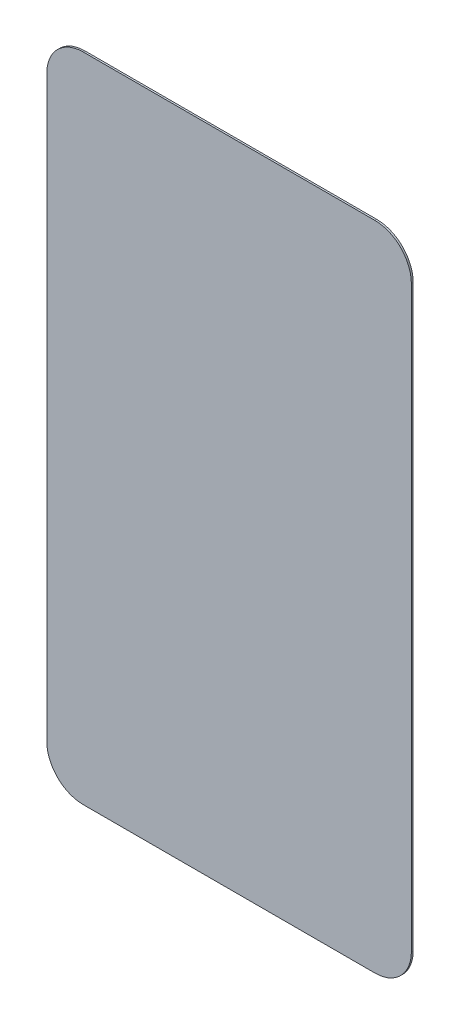
ISO-10303-21;
HEADER;
FILE_DESCRIPTION(('STEP AP214'),'2;1');
FILE_NAME('part.step','',(''),(''),'','','');
FILE_SCHEMA(('AUTOMOTIVE_DESIGN { 1 0 10303 214 1 1 1 1 }'));
ENDSEC;
DATA;
#1=APPLICATION_CONTEXT('core data for automotive mechanical design processes');
#2=APPLICATION_PROTOCOL_DEFINITION('international standard','automotive_design',2000,#1);
#3=PRODUCT_CONTEXT('',#1,'mechanical');
#4=PRODUCT('Part','Part','',(#3));
#5=PRODUCT_RELATED_PRODUCT_CATEGORY('part','',(#4));
#6=PRODUCT_DEFINITION_FORMATION('','',#4);
#7=PRODUCT_DEFINITION_CONTEXT('part definition',#1,'design');
#8=PRODUCT_DEFINITION('design','',#6,#7);
#9=PRODUCT_DEFINITION_SHAPE('','',#8);
#10=(LENGTH_UNIT() NAMED_UNIT(*) SI_UNIT(.MILLI.,.METRE.));
#11=(NAMED_UNIT(*) PLANE_ANGLE_UNIT() SI_UNIT($,.RADIAN.));
#12=(NAMED_UNIT(*) SI_UNIT($,.STERADIAN.) SOLID_ANGLE_UNIT());
#13=UNCERTAINTY_MEASURE_WITH_UNIT(LENGTH_MEASURE(1.E-05),#10,'distance_accuracy_value','');
#14=(GEOMETRIC_REPRESENTATION_CONTEXT(3) GLOBAL_UNCERTAINTY_ASSIGNED_CONTEXT((#13)) GLOBAL_UNIT_ASSIGNED_CONTEXT((#10,
#11,#12)) REPRESENTATION_CONTEXT('',''));
#15=CARTESIAN_POINT('',(0.,0.,0.));
#16=DIRECTION('',(0.,0.,1.));
#17=DIRECTION('',(1.,0.,0.));
#18=AXIS2_PLACEMENT_3D('',#15,#16,#17);
#19=CARTESIAN_POINT('',(-32.4685295093058,81.3436245572609,0.5));
#20=DIRECTION('',(0.,0.,-1.));
#21=DIRECTION('',(-1.,0.,0.));
#22=AXIS2_PLACEMENT_3D('',#19,#20,#21);
#23=CYLINDRICAL_SURFACE('',#22,9.99999999999999);
#24=CARTESIAN_POINT('',(-32.4685295093058,81.3436245572609,0.));
#25=DIRECTION('',(0.,0.,1.));
#26=DIRECTION('',(1.,0.,0.));
#27=AXIS2_PLACEMENT_3D('',#24,#25,#26);
#28=CIRCLE('',#27,9.99999999999999);
#29=CARTESIAN_POINT('',(-32.4685295093058,91.3436245572609,0.));
#30=VERTEX_POINT('',#29);
#31=CARTESIAN_POINT('',(-42.4685295093058,81.3436245572609,0.));
#32=VERTEX_POINT('',#31);
#33=EDGE_CURVE('E127',#30,#32,#28,.T.);
#34=ORIENTED_EDGE('',*,*,#33,.T.);
#35=DIRECTION('',(0.,0.,-1.));
#36=VECTOR('',#35,1.);
#37=CARTESIAN_POINT('',(-42.4685295093058,81.3436245572609,0.5));
#38=LINE('',#37,#36);
#39=CARTESIAN_POINT('',(-42.4685295093058,81.3436245572609,0.5));
#40=VERTEX_POINT('',#39);
#41=EDGE_CURVE('E11',#40,#32,#38,.T.);
#42=ORIENTED_EDGE('',*,*,#41,.F.);
#43=CARTESIAN_POINT('',(-32.4685295093058,81.3436245572609,0.5));
#44=DIRECTION('',(0.,0.,1.));
#45=DIRECTION('',(1.,0.,0.));
#46=AXIS2_PLACEMENT_3D('',#43,#44,#45);
#47=CIRCLE('',#46,9.99999999999999);
#48=CARTESIAN_POINT('',(-32.4685295093058,91.3436245572609,0.5));
#49=VERTEX_POINT('',#48);
#50=EDGE_CURVE('E141',#49,#40,#47,.T.);
#51=ORIENTED_EDGE('',*,*,#50,.F.);
#52=DIRECTION('',(0.,0.,-1.));
#53=VECTOR('',#52,1.);
#54=CARTESIAN_POINT('',(-32.4685295093058,91.3436245572609,0.5));
#55=LINE('',#54,#53);
#56=EDGE_CURVE('E123',#49,#30,#55,.T.);
#57=ORIENTED_EDGE('',*,*,#56,.T.);
#58=EDGE_LOOP('',(#34,#42,#51,#57));
#59=FACE_BOUND('',#58,.T.);
#60=ADVANCED_FACE('F31',(#59),#23,.T.);
#61=CARTESIAN_POINT('',(-42.4685295093058,81.3436245572609,0.5));
#62=DIRECTION('',(1.,0.,0.));
#63=DIRECTION('',(0.,1.,0.));
#64=AXIS2_PLACEMENT_3D('',#61,#62,#63);
#65=PLANE('',#64);
#66=DIRECTION('',(0.,-1.,0.));
#67=VECTOR('',#66,1.);
#68=CARTESIAN_POINT('',(-42.4685295093058,81.3436245572609,0.));
#69=LINE('',#68,#67);
#70=CARTESIAN_POINT('',(-42.4685295093058,-77.4713540090674,0.));
#71=VERTEX_POINT('',#70);
#72=EDGE_CURVE('E130',#32,#71,#69,.T.);
#73=ORIENTED_EDGE('',*,*,#72,.T.);
#74=DIRECTION('',(0.,0.,-1.));
#75=VECTOR('',#74,1.);
#76=CARTESIAN_POINT('',(-42.4685295093058,-77.4713540090674,0.5));
#77=LINE('',#76,#75);
#78=CARTESIAN_POINT('',(-42.4685295093058,-77.4713540090674,0.5));
#79=VERTEX_POINT('',#78);
#80=EDGE_CURVE('E39',#79,#71,#77,.T.);
#81=ORIENTED_EDGE('',*,*,#80,.F.);
#82=DIRECTION('',(0.,-1.,0.));
#83=VECTOR('',#82,1.);
#84=CARTESIAN_POINT('',(-42.4685295093058,81.3436245572609,0.5));
#85=LINE('',#84,#83);
#86=EDGE_CURVE('E90',#40,#79,#85,.T.);
#87=ORIENTED_EDGE('',*,*,#86,.F.);
#88=ORIENTED_EDGE('',*,*,#41,.T.);
#89=EDGE_LOOP('',(#73,#81,#87,#88));
#90=FACE_BOUND('',#89,.T.);
#91=ADVANCED_FACE('F176',(#90),#65,.F.);
#92=CARTESIAN_POINT('',(-32.4685295093058,-77.4713540090674,0.5));
#93=DIRECTION('',(0.,0.,-1.));
#94=DIRECTION('',(-1.,0.,0.));
#95=AXIS2_PLACEMENT_3D('',#92,#93,#94);
#96=CYLINDRICAL_SURFACE('',#95,10.);
#97=CARTESIAN_POINT('',(-32.4685295093058,-77.4713540090674,0.));
#98=DIRECTION('',(0.,0.,1.));
#99=DIRECTION('',(1.,0.,0.));
#100=AXIS2_PLACEMENT_3D('',#97,#98,#99);
#101=CIRCLE('',#100,10.);
#102=CARTESIAN_POINT('',(-32.4685295093058,-87.4713540090674,0.));
#103=VERTEX_POINT('',#102);
#104=EDGE_CURVE('E132',#71,#103,#101,.T.);
#105=ORIENTED_EDGE('',*,*,#104,.T.);
#106=DIRECTION('',(0.,0.,-1.));
#107=VECTOR('',#106,1.);
#108=CARTESIAN_POINT('',(-32.4685295093058,-87.4713540090674,0.5));
#109=LINE('',#108,#107);
#110=CARTESIAN_POINT('',(-32.4685295093058,-87.4713540090674,0.5));
#111=VERTEX_POINT('',#110);
#112=EDGE_CURVE('E148',#111,#103,#109,.T.);
#113=ORIENTED_EDGE('',*,*,#112,.F.);
#114=CARTESIAN_POINT('',(-32.4685295093058,-77.4713540090674,0.5));
#115=DIRECTION('',(0.,0.,1.));
#116=DIRECTION('',(1.,0.,0.));
#117=AXIS2_PLACEMENT_3D('',#114,#115,#116);
#118=CIRCLE('',#117,10.);
#119=EDGE_CURVE('E156',#79,#111,#118,.T.);
#120=ORIENTED_EDGE('',*,*,#119,.F.);
#121=ORIENTED_EDGE('',*,*,#80,.T.);
#122=EDGE_LOOP('',(#105,#113,#120,#121));
#123=FACE_BOUND('',#122,.T.);
#124=ADVANCED_FACE('F154',(#123),#96,.T.);
#125=CARTESIAN_POINT('',(-32.4685295093058,-87.4713540090674,0.5));
#126=DIRECTION('',(0.,1.,0.));
#127=DIRECTION('',(0.,0.,1.));
#128=AXIS2_PLACEMENT_3D('',#125,#126,#127);
#129=PLANE('',#128);
#130=DIRECTION('',(1.,0.,0.));
#131=VECTOR('',#130,1.);
#132=CARTESIAN_POINT('',(-32.4685295093058,-87.4713540090674,0.));
#133=LINE('',#132,#131);
#134=CARTESIAN_POINT('',(47.5314704906942,-87.4713540090674,0.));
#135=VERTEX_POINT('',#134);
#136=EDGE_CURVE('E134',#103,#135,#133,.T.);
#137=ORIENTED_EDGE('',*,*,#136,.T.);
#138=DIRECTION('',(0.,0.,-1.));
#139=VECTOR('',#138,1.);
#140=CARTESIAN_POINT('',(47.5314704906942,-87.4713540090674,0.5));
#141=LINE('',#140,#139);
#142=CARTESIAN_POINT('',(47.5314704906942,-87.4713540090674,0.5));
#143=VERTEX_POINT('',#142);
#144=EDGE_CURVE('E145',#143,#135,#141,.T.);
#145=ORIENTED_EDGE('',*,*,#144,.F.);
#146=DIRECTION('',(1.,0.,0.));
#147=VECTOR('',#146,1.);
#148=CARTESIAN_POINT('',(-32.4685295093058,-87.4713540090674,0.5));
#149=LINE('',#148,#147);
#150=EDGE_CURVE('E168',#111,#143,#149,.T.);
#151=ORIENTED_EDGE('',*,*,#150,.F.);
#152=ORIENTED_EDGE('',*,*,#112,.T.);
#153=EDGE_LOOP('',(#137,#145,#151,#152));
#154=FACE_BOUND('',#153,.T.);
#155=ADVANCED_FACE('F164',(#154),#129,.F.);
#156=CARTESIAN_POINT('',(47.5314704906942,-77.4713540090674,0.5));
#157=DIRECTION('',(0.,0.,-1.));
#158=DIRECTION('',(-1.,0.,0.));
#159=AXIS2_PLACEMENT_3D('',#156,#157,#158);
#160=CYLINDRICAL_SURFACE('',#159,10.);
#161=CARTESIAN_POINT('',(47.5314704906942,-77.4713540090674,0.));
#162=DIRECTION('',(0.,0.,1.));
#163=DIRECTION('',(1.,0.,0.));
#164=AXIS2_PLACEMENT_3D('',#161,#162,#163);
#165=CIRCLE('',#164,10.);
#166=CARTESIAN_POINT('',(57.5314704906942,-77.4713540090674,0.));
#167=VERTEX_POINT('',#166);
#168=EDGE_CURVE('E136',#135,#167,#165,.T.);
#169=ORIENTED_EDGE('',*,*,#168,.T.);
#170=DIRECTION('',(0.,0.,-1.));
#171=VECTOR('',#170,1.);
#172=CARTESIAN_POINT('',(57.5314704906942,-77.4713540090674,0.5));
#173=LINE('',#172,#171);
#174=CARTESIAN_POINT('',(57.5314704906942,-77.4713540090674,0.5));
#175=VERTEX_POINT('',#174);
#176=EDGE_CURVE('E118',#175,#167,#173,.T.);
#177=ORIENTED_EDGE('',*,*,#176,.F.);
#178=CARTESIAN_POINT('',(47.5314704906942,-77.4713540090674,0.5));
#179=DIRECTION('',(0.,0.,1.));
#180=DIRECTION('',(1.,0.,0.));
#181=AXIS2_PLACEMENT_3D('',#178,#179,#180);
#182=CIRCLE('',#181,10.);
#183=EDGE_CURVE('E109',#143,#175,#182,.T.);
#184=ORIENTED_EDGE('',*,*,#183,.F.);
#185=ORIENTED_EDGE('',*,*,#144,.T.);
#186=EDGE_LOOP('',(#169,#177,#184,#185));
#187=FACE_BOUND('',#186,.T.);
#188=ADVANCED_FACE('F167',(#187),#160,.T.);
#189=CARTESIAN_POINT('',(57.5314704906942,81.3436245572609,0.5));
#190=DIRECTION('',(-1.,0.,0.));
#191=DIRECTION('',(0.,-1.,0.));
#192=AXIS2_PLACEMENT_3D('',#189,#190,#191);
#193=PLANE('',#192);
#194=DIRECTION('',(0.,1.,0.));
#195=VECTOR('',#194,1.);
#196=CARTESIAN_POINT('',(57.5314704906942,81.3436245572609,0.));
#197=LINE('',#196,#195);
#198=CARTESIAN_POINT('',(57.5314704906942,81.3436245572609,0.));
#199=VERTEX_POINT('',#198);
#200=EDGE_CURVE('E117',#167,#199,#197,.T.);
#201=ORIENTED_EDGE('',*,*,#200,.T.);
#202=DIRECTION('',(0.,0.,-1.));
#203=VECTOR('',#202,1.);
#204=CARTESIAN_POINT('',(57.5314704906942,81.3436245572609,0.5));
#205=LINE('',#204,#203);
#206=CARTESIAN_POINT('',(57.5314704906942,81.3436245572609,0.5));
#207=VERTEX_POINT('',#206);
#208=EDGE_CURVE('E114',#207,#199,#205,.T.);
#209=ORIENTED_EDGE('',*,*,#208,.F.);
#210=DIRECTION('',(0.,1.,0.));
#211=VECTOR('',#210,1.);
#212=CARTESIAN_POINT('',(57.5314704906942,81.3436245572609,0.5));
#213=LINE('',#212,#211);
#214=EDGE_CURVE('E103',#175,#207,#213,.T.);
#215=ORIENTED_EDGE('',*,*,#214,.F.);
#216=ORIENTED_EDGE('',*,*,#176,.T.);
#217=EDGE_LOOP('',(#201,#209,#215,#216));
#218=FACE_BOUND('',#217,.T.);
#219=ADVANCED_FACE('F115',(#218),#193,.F.);
#220=CARTESIAN_POINT('',(47.5314704906942,81.3436245572609,0.5));
#221=DIRECTION('',(0.,0.,-1.));
#222=DIRECTION('',(-1.,0.,0.));
#223=AXIS2_PLACEMENT_3D('',#220,#221,#222);
#224=CYLINDRICAL_SURFACE('',#223,10.);
#225=CARTESIAN_POINT('',(47.5314704906942,81.3436245572609,0.));
#226=DIRECTION('',(0.,0.,1.));
#227=DIRECTION('',(1.,0.,0.));
#228=AXIS2_PLACEMENT_3D('',#225,#226,#227);
#229=CIRCLE('',#228,10.);
#230=CARTESIAN_POINT('',(47.5314704906942,91.3436245572609,0.));
#231=VERTEX_POINT('',#230);
#232=EDGE_CURVE('E76',#199,#231,#229,.T.);
#233=ORIENTED_EDGE('',*,*,#232,.T.);
#234=DIRECTION('',(0.,0.,-1.));
#235=VECTOR('',#234,1.);
#236=CARTESIAN_POINT('',(47.5314704906942,91.3436245572609,0.5));
#237=LINE('',#236,#235);
#238=CARTESIAN_POINT('',(47.5314704906942,91.3436245572609,0.5));
#239=VERTEX_POINT('',#238);
#240=EDGE_CURVE('E119',#239,#231,#237,.T.);
#241=ORIENTED_EDGE('',*,*,#240,.F.);
#242=CARTESIAN_POINT('',(47.5314704906942,81.3436245572609,0.5));
#243=DIRECTION('',(0.,0.,1.));
#244=DIRECTION('',(1.,0.,0.));
#245=AXIS2_PLACEMENT_3D('',#242,#243,#244);
#246=CIRCLE('',#245,10.);
#247=EDGE_CURVE('E107',#207,#239,#246,.T.);
#248=ORIENTED_EDGE('',*,*,#247,.F.);
#249=ORIENTED_EDGE('',*,*,#208,.T.);
#250=EDGE_LOOP('',(#233,#241,#248,#249));
#251=FACE_BOUND('',#250,.T.);
#252=ADVANCED_FACE('F121',(#251),#224,.T.);
#253=CARTESIAN_POINT('',(-32.4685295093058,91.3436245572609,0.5));
#254=DIRECTION('',(0.,-1.,0.));
#255=DIRECTION('',(1.,0.,0.));
#256=AXIS2_PLACEMENT_3D('',#253,#254,#255);
#257=PLANE('',#256);
#258=DIRECTION('',(-1.,0.,0.));
#259=VECTOR('',#258,1.);
#260=CARTESIAN_POINT('',(-32.4685295093058,91.3436245572609,0.));
#261=LINE('',#260,#259);
#262=EDGE_CURVE('E82',#231,#30,#261,.T.);
#263=ORIENTED_EDGE('',*,*,#262,.T.);
#264=ORIENTED_EDGE('',*,*,#56,.F.);
#265=DIRECTION('',(-1.,0.,0.));
#266=VECTOR('',#265,1.);
#267=CARTESIAN_POINT('',(-32.4685295093058,91.3436245572609,0.5));
#268=LINE('',#267,#266);
#269=EDGE_CURVE('E47',#239,#49,#268,.T.);
#270=ORIENTED_EDGE('',*,*,#269,.F.);
#271=ORIENTED_EDGE('',*,*,#240,.T.);
#272=EDGE_LOOP('',(#263,#264,#270,#271));
#273=FACE_BOUND('',#272,.T.);
#274=ADVANCED_FACE('F192',(#273),#257,.F.);
#275=CARTESIAN_POINT('',(-32.4685295093058,81.3436245572609,0.5));
#276=DIRECTION('',(0.,0.,1.));
#277=DIRECTION('',(1.,0.,0.));
#278=AXIS2_PLACEMENT_3D('',#275,#276,#277);
#279=PLANE('',#278);
#280=ORIENTED_EDGE('',*,*,#50,.T.);
#281=ORIENTED_EDGE('',*,*,#86,.T.);
#282=ORIENTED_EDGE('',*,*,#119,.T.);
#283=ORIENTED_EDGE('',*,*,#150,.T.);
#284=ORIENTED_EDGE('',*,*,#183,.T.);
#285=ORIENTED_EDGE('',*,*,#214,.T.);
#286=ORIENTED_EDGE('',*,*,#247,.T.);
#287=ORIENTED_EDGE('',*,*,#269,.T.);
#288=EDGE_LOOP('',(#280,#281,#282,#283,#284,#285,#286,#287));
#289=FACE_BOUND('',#288,.T.);
#290=ADVANCED_FACE('F105',(#289),#279,.T.);
#291=CARTESIAN_POINT('',(-32.4685295093058,81.3436245572609,0.));
#292=DIRECTION('',(0.,0.,1.));
#293=DIRECTION('',(1.,0.,0.));
#294=AXIS2_PLACEMENT_3D('',#291,#292,#293);
#295=PLANE('',#294);
#296=ORIENTED_EDGE('',*,*,#33,.F.);
#297=ORIENTED_EDGE('',*,*,#262,.F.);
#298=ORIENTED_EDGE('',*,*,#232,.F.);
#299=ORIENTED_EDGE('',*,*,#200,.F.);
#300=ORIENTED_EDGE('',*,*,#168,.F.);
#301=ORIENTED_EDGE('',*,*,#136,.F.);
#302=ORIENTED_EDGE('',*,*,#104,.F.);
#303=ORIENTED_EDGE('',*,*,#72,.F.);
#304=EDGE_LOOP('',(#296,#297,#298,#299,#300,#301,#302,#303));
#305=FACE_BOUND('',#304,.T.);
#306=ADVANCED_FACE('F160',(#305),#295,.F.);
#307=CLOSED_SHELL('',(#60,#91,#124,#155,#188,#219,#252,#274,#290,#306));
#308=MANIFOLD_SOLID_BREP('B2',#307);
#309=ADVANCED_BREP_SHAPE_REPRESENTATION('',(#18,#308),#14);
#310=SHAPE_DEFINITION_REPRESENTATION(#9,#309);
ENDSEC;
END-ISO-10303-21;
